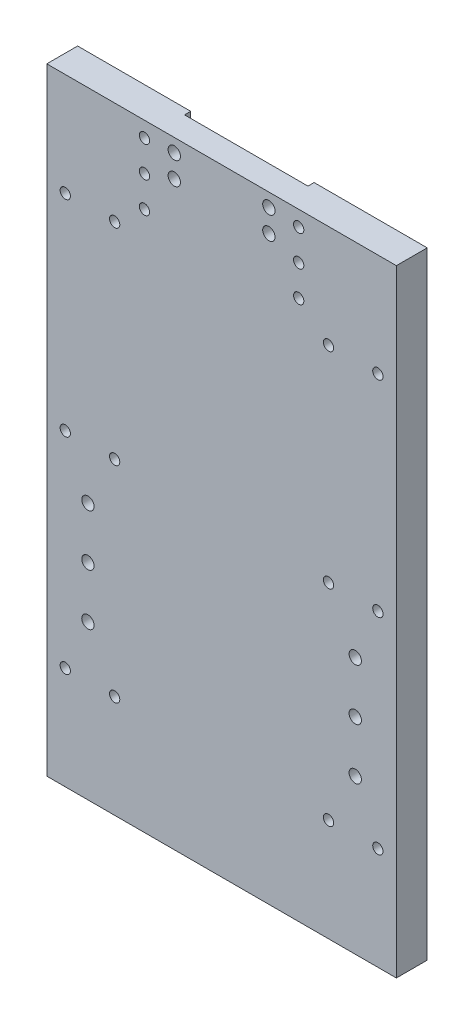
ISO-10303-21;
HEADER;
FILE_DESCRIPTION(('STEP AP214'),'2;1');
FILE_NAME('part.step','',(''),(''),'','','');
FILE_SCHEMA(('AUTOMOTIVE_DESIGN { 1 0 10303 214 1 1 1 1 }'));
ENDSEC;
DATA;
#1=APPLICATION_CONTEXT('core data for automotive mechanical design processes');
#2=APPLICATION_PROTOCOL_DEFINITION('international standard','automotive_design',2000,#1);
#3=PRODUCT_CONTEXT('',#1,'mechanical');
#4=PRODUCT('Part','Part','',(#3));
#5=PRODUCT_RELATED_PRODUCT_CATEGORY('part','',(#4));
#6=PRODUCT_DEFINITION_FORMATION('','',#4);
#7=PRODUCT_DEFINITION_CONTEXT('part definition',#1,'design');
#8=PRODUCT_DEFINITION('design','',#6,#7);
#9=PRODUCT_DEFINITION_SHAPE('','',#8);
#10=(LENGTH_UNIT() NAMED_UNIT(*) SI_UNIT(.MILLI.,.METRE.));
#11=(NAMED_UNIT(*) PLANE_ANGLE_UNIT() SI_UNIT($,.RADIAN.));
#12=(NAMED_UNIT(*) SI_UNIT($,.STERADIAN.) SOLID_ANGLE_UNIT());
#13=UNCERTAINTY_MEASURE_WITH_UNIT(LENGTH_MEASURE(1.E-05),#10,'distance_accuracy_value','');
#14=(GEOMETRIC_REPRESENTATION_CONTEXT(3) GLOBAL_UNCERTAINTY_ASSIGNED_CONTEXT((#13)) GLOBAL_UNIT_ASSIGNED_CONTEXT((#10,
#11,#12)) REPRESENTATION_CONTEXT('',''));
#15=CARTESIAN_POINT('',(0.,0.,0.));
#16=DIRECTION('',(0.,0.,1.));
#17=DIRECTION('',(1.,0.,0.));
#18=AXIS2_PLACEMENT_3D('',#15,#16,#17);
#19=CARTESIAN_POINT('',(0.,0.,15.));
#20=DIRECTION('',(1.,0.,0.));
#21=DIRECTION('',(0.,0.,-1.));
#22=AXIS2_PLACEMENT_3D('',#19,#20,#21);
#23=PLANE('',#22);
#24=DIRECTION('',(0.,-1.,0.));
#25=VECTOR('',#24,1.);
#26=CARTESIAN_POINT('',(0.,0.,0.));
#27=LINE('',#26,#25);
#28=CARTESIAN_POINT('',(0.,300.,0.));
#29=VERTEX_POINT('',#28);
#30=CARTESIAN_POINT('',(0.,0.,0.));
#31=VERTEX_POINT('',#30);
#32=EDGE_CURVE('E213',#29,#31,#27,.T.);
#33=ORIENTED_EDGE('',*,*,#32,.T.);
#34=DIRECTION('',(0.,0.,-1.));
#35=VECTOR('',#34,1.);
#36=CARTESIAN_POINT('',(0.,0.,15.));
#37=LINE('',#36,#35);
#38=CARTESIAN_POINT('',(0.,0.,15.));
#39=VERTEX_POINT('',#38);
#40=EDGE_CURVE('E11',#39,#31,#37,.T.);
#41=ORIENTED_EDGE('',*,*,#40,.F.);
#42=DIRECTION('',(0.,-1.,0.));
#43=VECTOR('',#42,1.);
#44=CARTESIAN_POINT('',(0.,0.,15.));
#45=LINE('',#44,#43);
#46=CARTESIAN_POINT('',(0.,300.,15.));
#47=VERTEX_POINT('',#46);
#48=EDGE_CURVE('E216',#47,#39,#45,.T.);
#49=ORIENTED_EDGE('',*,*,#48,.F.);
#50=DIRECTION('',(0.,0.,-1.));
#51=VECTOR('',#50,1.);
#52=CARTESIAN_POINT('',(0.,300.,15.));
#53=LINE('',#52,#51);
#54=EDGE_CURVE('E223',#47,#29,#53,.T.);
#55=ORIENTED_EDGE('',*,*,#54,.T.);
#56=EDGE_LOOP('',(#33,#41,#49,#55));
#57=FACE_BOUND('',#56,.T.);
#58=ADVANCED_FACE('F32',(#57),#23,.F.);
#59=CARTESIAN_POINT('',(0.,0.,15.));
#60=DIRECTION('',(0.,1.,0.));
#61=DIRECTION('',(0.,0.,1.));
#62=AXIS2_PLACEMENT_3D('',#59,#60,#61);
#63=PLANE('',#62);
#64=DIRECTION('',(1.,0.,0.));
#65=VECTOR('',#64,1.);
#66=CARTESIAN_POINT('',(0.,0.,0.));
#67=LINE('',#66,#65);
#68=CARTESIAN_POINT('',(170.,0.,0.));
#69=VERTEX_POINT('',#68);
#70=EDGE_CURVE('E226',#31,#69,#67,.T.);
#71=ORIENTED_EDGE('',*,*,#70,.T.);
#72=DIRECTION('',(0.,0.,-1.));
#73=VECTOR('',#72,1.);
#74=CARTESIAN_POINT('',(170.,0.,15.));
#75=LINE('',#74,#73);
#76=CARTESIAN_POINT('',(170.,0.,15.));
#77=VERTEX_POINT('',#76);
#78=EDGE_CURVE('E39',#77,#69,#75,.T.);
#79=ORIENTED_EDGE('',*,*,#78,.F.);
#80=DIRECTION('',(1.,0.,0.));
#81=VECTOR('',#80,1.);
#82=CARTESIAN_POINT('',(0.,0.,15.));
#83=LINE('',#82,#81);
#84=EDGE_CURVE('E83',#39,#77,#83,.T.);
#85=ORIENTED_EDGE('',*,*,#84,.F.);
#86=ORIENTED_EDGE('',*,*,#40,.T.);
#87=EDGE_LOOP('',(#71,#79,#85,#86));
#88=FACE_BOUND('',#87,.T.);
#89=ADVANCED_FACE('F267',(#88),#63,.F.);
#90=CARTESIAN_POINT('',(170.,0.,15.));
#91=DIRECTION('',(-1.,0.,0.));
#92=DIRECTION('',(0.,0.,1.));
#93=AXIS2_PLACEMENT_3D('',#90,#91,#92);
#94=PLANE('',#93);
#95=DIRECTION('',(0.,1.,0.));
#96=VECTOR('',#95,1.);
#97=CARTESIAN_POINT('',(170.,0.,0.));
#98=LINE('',#97,#96);
#99=CARTESIAN_POINT('',(170.,300.,0.));
#100=VERTEX_POINT('',#99);
#101=EDGE_CURVE('E228',#69,#100,#98,.T.);
#102=ORIENTED_EDGE('',*,*,#101,.T.);
#103=DIRECTION('',(0.,0.,-1.));
#104=VECTOR('',#103,1.);
#105=CARTESIAN_POINT('',(170.,300.,15.));
#106=LINE('',#105,#104);
#107=CARTESIAN_POINT('',(170.,300.,15.));
#108=VERTEX_POINT('',#107);
#109=EDGE_CURVE('E233',#108,#100,#106,.T.);
#110=ORIENTED_EDGE('',*,*,#109,.F.);
#111=DIRECTION('',(0.,1.,0.));
#112=VECTOR('',#111,1.);
#113=CARTESIAN_POINT('',(170.,0.,15.));
#114=LINE('',#113,#112);
#115=EDGE_CURVE('E220',#77,#108,#114,.T.);
#116=ORIENTED_EDGE('',*,*,#115,.F.);
#117=ORIENTED_EDGE('',*,*,#78,.T.);
#118=EDGE_LOOP('',(#102,#110,#116,#117));
#119=FACE_BOUND('',#118,.T.);
#120=ADVANCED_FACE('F239',(#119),#94,.F.);
#121=CARTESIAN_POINT('',(0.,300.,15.));
#122=DIRECTION('',(0.,-1.,0.));
#123=DIRECTION('',(0.,0.,-1.));
#124=AXIS2_PLACEMENT_3D('',#121,#122,#123);
#125=PLANE('',#124);
#126=DIRECTION('',(-1.,0.,0.));
#127=VECTOR('',#126,1.);
#128=CARTESIAN_POINT('',(0.,300.,0.));
#129=LINE('',#128,#127);
#130=CARTESIAN_POINT('',(115.,300.,0.));
#131=VERTEX_POINT('',#130);
#132=EDGE_CURVE('E218',#100,#131,#129,.T.);
#133=ORIENTED_EDGE('',*,*,#132,.T.);
#134=DIRECTION('',(0.,0.,-1.));
#135=VECTOR('',#134,1.);
#136=CARTESIAN_POINT('',(115.,300.,3.));
#137=LINE('',#136,#135);
#138=CARTESIAN_POINT('',(115.,300.,3.));
#139=VERTEX_POINT('',#138);
#140=EDGE_CURVE('E138',#139,#131,#137,.T.);
#141=ORIENTED_EDGE('',*,*,#140,.F.);
#142=DIRECTION('',(1.,0.,0.));
#143=VECTOR('',#142,1.);
#144=CARTESIAN_POINT('',(115.,300.,3.));
#145=LINE('',#144,#143);
#146=CARTESIAN_POINT('',(55.,300.,3.));
#147=VERTEX_POINT('',#146);
#148=EDGE_CURVE('E112',#147,#139,#145,.T.);
#149=ORIENTED_EDGE('',*,*,#148,.F.);
#150=DIRECTION('',(0.,0.,-1.));
#151=VECTOR('',#150,1.);
#152=CARTESIAN_POINT('',(55.,300.,3.));
#153=LINE('',#152,#151);
#154=CARTESIAN_POINT('',(55.,300.,0.));
#155=VERTEX_POINT('',#154);
#156=EDGE_CURVE('E141',#147,#155,#153,.T.);
#157=ORIENTED_EDGE('',*,*,#156,.T.);
#158=EDGE_CURVE('E76',#155,#29,#129,.T.);
#159=ORIENTED_EDGE('',*,*,#158,.T.);
#160=ORIENTED_EDGE('',*,*,#54,.F.);
#161=DIRECTION('',(-1.,0.,0.));
#162=VECTOR('',#161,1.);
#163=CARTESIAN_POINT('',(0.,300.,15.));
#164=LINE('',#163,#162);
#165=EDGE_CURVE('E55',#108,#47,#164,.T.);
#166=ORIENTED_EDGE('',*,*,#165,.F.);
#167=ORIENTED_EDGE('',*,*,#109,.T.);
#168=EDGE_LOOP('',(#133,#141,#149,#157,#159,#160,#166,#167));
#169=FACE_BOUND('',#168,.T.);
#170=ADVANCED_FACE('F246',(#169),#125,.F.);
#171=CARTESIAN_POINT('',(0.,0.,15.));
#172=DIRECTION('',(0.,0.,-1.));
#173=DIRECTION('',(-1.,0.,0.));
#174=AXIS2_PLACEMENT_3D('',#171,#172,#173);
#175=PLANE('',#174);
#176=CARTESIAN_POINT('',(20.,125.,15.));
#177=DIRECTION('',(0.,0.,1.));
#178=DIRECTION('',(1.,0.,0.));
#179=AXIS2_PLACEMENT_3D('',#176,#177,#178);
#180=CIRCLE('',#179,3.);
#181=CARTESIAN_POINT('',(23.,125.,15.));
#182=VERTEX_POINT('',#181);
#183=EDGE_CURVE('E581',#182,#182,#180,.T.);
#184=ORIENTED_EDGE('',*,*,#183,.F.);
#185=EDGE_LOOP('',(#184));
#186=FACE_BOUND('',#185,.T.);
#187=CARTESIAN_POINT('',(20.,75.,15.));
#188=DIRECTION('',(0.,0.,1.));
#189=DIRECTION('',(-1.,0.,0.));
#190=AXIS2_PLACEMENT_3D('',#187,#188,#189);
#191=CIRCLE('',#190,3.);
#192=CARTESIAN_POINT('',(17.,75.,15.));
#193=VERTEX_POINT('',#192);
#194=EDGE_CURVE('E587',#193,#193,#191,.T.);
#195=ORIENTED_EDGE('',*,*,#194,.F.);
#196=EDGE_LOOP('',(#195));
#197=FACE_BOUND('',#196,.T.);
#198=CARTESIAN_POINT('',(150.,75.,15.));
#199=DIRECTION('',(0.,0.,1.));
#200=DIRECTION('',(1.,0.,0.));
#201=AXIS2_PLACEMENT_3D('',#198,#199,#200);
#202=CIRCLE('',#201,3.00000000000002);
#203=CARTESIAN_POINT('',(153.,75.,15.));
#204=VERTEX_POINT('',#203);
#205=EDGE_CURVE('E595',#204,#204,#202,.T.);
#206=ORIENTED_EDGE('',*,*,#205,.F.);
#207=EDGE_LOOP('',(#206));
#208=FACE_BOUND('',#207,.T.);
#209=CARTESIAN_POINT('',(150.,125.,15.));
#210=DIRECTION('',(0.,0.,1.));
#211=DIRECTION('',(-1.,0.,0.));
#212=AXIS2_PLACEMENT_3D('',#209,#210,#211);
#213=CIRCLE('',#212,3.00000000000002);
#214=CARTESIAN_POINT('',(147.,125.,15.));
#215=VERTEX_POINT('',#214);
#216=EDGE_CURVE('E601',#215,#215,#213,.T.);
#217=ORIENTED_EDGE('',*,*,#216,.F.);
#218=EDGE_LOOP('',(#217));
#219=FACE_BOUND('',#218,.T.);
#220=CARTESIAN_POINT('',(150.,100.,15.));
#221=DIRECTION('',(0.,0.,1.));
#222=DIRECTION('',(-1.,0.,0.));
#223=AXIS2_PLACEMENT_3D('',#220,#221,#222);
#224=CIRCLE('',#223,3.00000000000002);
#225=CARTESIAN_POINT('',(147.,100.,15.));
#226=VERTEX_POINT('',#225);
#227=EDGE_CURVE('E607',#226,#226,#224,.T.);
#228=ORIENTED_EDGE('',*,*,#227,.F.);
#229=EDGE_LOOP('',(#228));
#230=FACE_BOUND('',#229,.T.);
#231=CARTESIAN_POINT('',(20.,100.,15.));
#232=DIRECTION('',(0.,0.,1.));
#233=DIRECTION('',(1.,0.,0.));
#234=AXIS2_PLACEMENT_3D('',#231,#232,#233);
#235=CIRCLE('',#234,3.);
#236=CARTESIAN_POINT('',(23.,100.,15.));
#237=VERTEX_POINT('',#236);
#238=EDGE_CURVE('E584',#237,#237,#235,.T.);
#239=ORIENTED_EDGE('',*,*,#238,.F.);
#240=EDGE_LOOP('',(#239));
#241=FACE_BOUND('',#240,.T.);
#242=CARTESIAN_POINT('',(47.5,277.5,15.));
#243=DIRECTION('',(0.,0.,1.));
#244=DIRECTION('',(1.,0.,0.));
#245=AXIS2_PLACEMENT_3D('',#242,#243,#244);
#246=CIRCLE('',#245,2.5);
#247=CARTESIAN_POINT('',(50.,277.5,15.));
#248=VERTEX_POINT('',#247);
#249=EDGE_CURVE('E620',#248,#248,#246,.T.);
#250=ORIENTED_EDGE('',*,*,#249,.F.);
#251=EDGE_LOOP('',(#250));
#252=FACE_BOUND('',#251,.T.);
#253=CARTESIAN_POINT('',(47.5,262.5,15.));
#254=DIRECTION('',(0.,0.,1.));
#255=DIRECTION('',(-1.,0.,0.));
#256=AXIS2_PLACEMENT_3D('',#253,#254,#255);
#257=CIRCLE('',#256,2.5);
#258=CARTESIAN_POINT('',(45.,262.5,15.));
#259=VERTEX_POINT('',#258);
#260=EDGE_CURVE('E626',#259,#259,#257,.T.);
#261=ORIENTED_EDGE('',*,*,#260,.F.);
#262=EDGE_LOOP('',(#261));
#263=FACE_BOUND('',#262,.T.);
#264=CARTESIAN_POINT('',(122.5,262.5,15.));
#265=DIRECTION('',(0.,0.,1.));
#266=DIRECTION('',(1.,0.,0.));
#267=AXIS2_PLACEMENT_3D('',#264,#265,#266);
#268=CIRCLE('',#267,2.5);
#269=CARTESIAN_POINT('',(125.,262.5,15.));
#270=VERTEX_POINT('',#269);
#271=EDGE_CURVE('E632',#270,#270,#268,.T.);
#272=ORIENTED_EDGE('',*,*,#271,.F.);
#273=EDGE_LOOP('',(#272));
#274=FACE_BOUND('',#273,.T.);
#275=CARTESIAN_POINT('',(122.5,277.5,15.));
#276=DIRECTION('',(0.,0.,1.));
#277=DIRECTION('',(-1.,0.,0.));
#278=AXIS2_PLACEMENT_3D('',#275,#276,#277);
#279=CIRCLE('',#278,2.5);
#280=CARTESIAN_POINT('',(120.,277.5,15.));
#281=VERTEX_POINT('',#280);
#282=EDGE_CURVE('E638',#281,#281,#279,.T.);
#283=ORIENTED_EDGE('',*,*,#282,.F.);
#284=EDGE_LOOP('',(#283));
#285=FACE_BOUND('',#284,.T.);
#286=CARTESIAN_POINT('',(122.5,292.5,15.));
#287=DIRECTION('',(0.,0.,1.));
#288=DIRECTION('',(-1.,0.,0.));
#289=AXIS2_PLACEMENT_3D('',#286,#287,#288);
#290=CIRCLE('',#289,2.5);
#291=CARTESIAN_POINT('',(120.,292.5,15.));
#292=VERTEX_POINT('',#291);
#293=EDGE_CURVE('E613',#292,#292,#290,.T.);
#294=ORIENTED_EDGE('',*,*,#293,.F.);
#295=EDGE_LOOP('',(#294));
#296=FACE_BOUND('',#295,.T.);
#297=CARTESIAN_POINT('',(47.5,292.5,15.));
#298=DIRECTION('',(0.,0.,1.));
#299=DIRECTION('',(1.,0.,0.));
#300=AXIS2_PLACEMENT_3D('',#297,#298,#299);
#301=CIRCLE('',#300,2.5);
#302=CARTESIAN_POINT('',(50.,292.5,15.));
#303=VERTEX_POINT('',#302);
#304=EDGE_CURVE('E619',#303,#303,#301,.T.);
#305=ORIENTED_EDGE('',*,*,#304,.F.);
#306=EDGE_LOOP('',(#305));
#307=FACE_BOUND('',#306,.T.);
#308=CARTESIAN_POINT('',(62.,282.5,15.));
#309=DIRECTION('',(0.,0.,-1.));
#310=DIRECTION('',(-1.,0.,0.));
#311=AXIS2_PLACEMENT_3D('',#308,#309,#310);
#312=CIRCLE('',#311,3.);
#313=CARTESIAN_POINT('',(59.,282.5,15.));
#314=VERTEX_POINT('',#313);
#315=EDGE_CURVE('E652',#314,#314,#312,.T.);
#316=ORIENTED_EDGE('',*,*,#315,.T.);
#317=EDGE_LOOP('',(#316));
#318=FACE_BOUND('',#317,.T.);
#319=CARTESIAN_POINT('',(108.,282.5,15.));
#320=DIRECTION('',(0.,0.,-1.));
#321=DIRECTION('',(-1.,0.,0.));
#322=AXIS2_PLACEMENT_3D('',#319,#320,#321);
#323=CIRCLE('',#322,3.00000000000001);
#324=CARTESIAN_POINT('',(105.,282.5,15.));
#325=VERTEX_POINT('',#324);
#326=EDGE_CURVE('E658',#325,#325,#323,.T.);
#327=ORIENTED_EDGE('',*,*,#326,.T.);
#328=EDGE_LOOP('',(#327));
#329=FACE_BOUND('',#328,.T.);
#330=CARTESIAN_POINT('',(62.,293.5,15.));
#331=DIRECTION('',(0.,0.,-1.));
#332=DIRECTION('',(-1.,0.,0.));
#333=AXIS2_PLACEMENT_3D('',#330,#331,#332);
#334=CIRCLE('',#333,3.);
#335=CARTESIAN_POINT('',(59.,293.5,15.));
#336=VERTEX_POINT('',#335);
#337=EDGE_CURVE('E664',#336,#336,#334,.T.);
#338=ORIENTED_EDGE('',*,*,#337,.T.);
#339=EDGE_LOOP('',(#338));
#340=FACE_BOUND('',#339,.T.);
#341=CARTESIAN_POINT('',(108.,293.5,15.));
#342=DIRECTION('',(0.,0.,-1.));
#343=DIRECTION('',(-1.,0.,0.));
#344=AXIS2_PLACEMENT_3D('',#341,#342,#343);
#345=CIRCLE('',#344,3.00000000000001);
#346=CARTESIAN_POINT('',(105.,293.5,15.));
#347=VERTEX_POINT('',#346);
#348=EDGE_CURVE('E136',#347,#347,#345,.T.);
#349=ORIENTED_EDGE('',*,*,#348,.T.);
#350=EDGE_LOOP('',(#349));
#351=FACE_BOUND('',#350,.T.);
#352=CARTESIAN_POINT('',(161.,250.,15.));
#353=DIRECTION('',(0.,0.,1.));
#354=DIRECTION('',(-1.,0.,0.));
#355=AXIS2_PLACEMENT_3D('',#352,#353,#354);
#356=CIRCLE('',#355,2.50000000000002);
#357=CARTESIAN_POINT('',(158.5,250.,15.));
#358=VERTEX_POINT('',#357);
#359=EDGE_CURVE('E140',#358,#358,#356,.T.);
#360=ORIENTED_EDGE('',*,*,#359,.F.);
#361=EDGE_LOOP('',(#360));
#362=FACE_BOUND('',#361,.T.);
#363=CARTESIAN_POINT('',(137.,250.,15.));
#364=DIRECTION('',(0.,0.,1.));
#365=DIRECTION('',(1.,0.,0.));
#366=AXIS2_PLACEMENT_3D('',#363,#364,#365);
#367=CIRCLE('',#366,2.5);
#368=CARTESIAN_POINT('',(139.5,250.,15.));
#369=VERTEX_POINT('',#368);
#370=EDGE_CURVE('E147',#369,#369,#367,.T.);
#371=ORIENTED_EDGE('',*,*,#370,.F.);
#372=EDGE_LOOP('',(#371));
#373=FACE_BOUND('',#372,.T.);
#374=CARTESIAN_POINT('',(161.,150.,15.));
#375=DIRECTION('',(0.,0.,1.));
#376=DIRECTION('',(-1.,0.,0.));
#377=AXIS2_PLACEMENT_3D('',#374,#375,#376);
#378=CIRCLE('',#377,2.50000000000002);
#379=CARTESIAN_POINT('',(158.5,150.,15.));
#380=VERTEX_POINT('',#379);
#381=EDGE_CURVE('E153',#380,#380,#378,.T.);
#382=ORIENTED_EDGE('',*,*,#381,.F.);
#383=EDGE_LOOP('',(#382));
#384=FACE_BOUND('',#383,.T.);
#385=CARTESIAN_POINT('',(137.,150.,15.));
#386=DIRECTION('',(0.,0.,1.));
#387=DIRECTION('',(1.,0.,0.));
#388=AXIS2_PLACEMENT_3D('',#385,#386,#387);
#389=CIRCLE('',#388,2.50000000000002);
#390=CARTESIAN_POINT('',(139.5,150.,15.));
#391=VERTEX_POINT('',#390);
#392=EDGE_CURVE('E159',#391,#391,#389,.T.);
#393=ORIENTED_EDGE('',*,*,#392,.F.);
#394=EDGE_LOOP('',(#393));
#395=FACE_BOUND('',#394,.T.);
#396=CARTESIAN_POINT('',(137.,50.,15.));
#397=DIRECTION('',(0.,0.,1.));
#398=DIRECTION('',(-1.,0.,0.));
#399=AXIS2_PLACEMENT_3D('',#396,#397,#398);
#400=CIRCLE('',#399,2.5);
#401=CARTESIAN_POINT('',(134.5,50.,15.));
#402=VERTEX_POINT('',#401);
#403=EDGE_CURVE('E165',#402,#402,#400,.T.);
#404=ORIENTED_EDGE('',*,*,#403,.F.);
#405=EDGE_LOOP('',(#404));
#406=FACE_BOUND('',#405,.T.);
#407=CARTESIAN_POINT('',(161.,50.,15.));
#408=DIRECTION('',(0.,0.,1.));
#409=DIRECTION('',(1.,0.,0.));
#410=AXIS2_PLACEMENT_3D('',#407,#408,#409);
#411=CIRCLE('',#410,2.50000000000002);
#412=CARTESIAN_POINT('',(163.5,50.,15.));
#413=VERTEX_POINT('',#412);
#414=EDGE_CURVE('E171',#413,#413,#411,.T.);
#415=ORIENTED_EDGE('',*,*,#414,.F.);
#416=EDGE_LOOP('',(#415));
#417=FACE_BOUND('',#416,.T.);
#418=CARTESIAN_POINT('',(9.00000000000004,50.,15.));
#419=DIRECTION('',(0.,0.,1.));
#420=DIRECTION('',(-1.,0.,0.));
#421=AXIS2_PLACEMENT_3D('',#418,#419,#420);
#422=CIRCLE('',#421,2.5);
#423=CARTESIAN_POINT('',(6.50000000000003,50.,15.));
#424=VERTEX_POINT('',#423);
#425=EDGE_CURVE('E177',#424,#424,#422,.T.);
#426=ORIENTED_EDGE('',*,*,#425,.F.);
#427=EDGE_LOOP('',(#426));
#428=FACE_BOUND('',#427,.T.);
#429=CARTESIAN_POINT('',(33.,50.,15.));
#430=DIRECTION('',(0.,0.,1.));
#431=DIRECTION('',(1.,0.,0.));
#432=AXIS2_PLACEMENT_3D('',#429,#430,#431);
#433=CIRCLE('',#432,2.50000000000001);
#434=CARTESIAN_POINT('',(35.5,50.,15.));
#435=VERTEX_POINT('',#434);
#436=EDGE_CURVE('E183',#435,#435,#433,.T.);
#437=ORIENTED_EDGE('',*,*,#436,.F.);
#438=EDGE_LOOP('',(#437));
#439=FACE_BOUND('',#438,.T.);
#440=CARTESIAN_POINT('',(33.,150.,15.));
#441=DIRECTION('',(0.,0.,1.));
#442=DIRECTION('',(-1.,0.,0.));
#443=AXIS2_PLACEMENT_3D('',#440,#441,#442);
#444=CIRCLE('',#443,2.5);
#445=CARTESIAN_POINT('',(30.5,150.,15.));
#446=VERTEX_POINT('',#445);
#447=EDGE_CURVE('E189',#446,#446,#444,.T.);
#448=ORIENTED_EDGE('',*,*,#447,.F.);
#449=EDGE_LOOP('',(#448));
#450=FACE_BOUND('',#449,.T.);
#451=CARTESIAN_POINT('',(9.00000000000001,150.,15.));
#452=DIRECTION('',(0.,0.,1.));
#453=DIRECTION('',(1.,0.,0.));
#454=AXIS2_PLACEMENT_3D('',#451,#452,#453);
#455=CIRCLE('',#454,2.5);
#456=CARTESIAN_POINT('',(11.5,150.,15.));
#457=VERTEX_POINT('',#456);
#458=EDGE_CURVE('E195',#457,#457,#455,.T.);
#459=ORIENTED_EDGE('',*,*,#458,.F.);
#460=EDGE_LOOP('',(#459));
#461=FACE_BOUND('',#460,.T.);
#462=CARTESIAN_POINT('',(33.,250.,15.));
#463=DIRECTION('',(0.,0.,1.));
#464=DIRECTION('',(-1.,0.,0.));
#465=AXIS2_PLACEMENT_3D('',#462,#463,#464);
#466=CIRCLE('',#465,2.5);
#467=CARTESIAN_POINT('',(30.5,250.,15.));
#468=VERTEX_POINT('',#467);
#469=EDGE_CURVE('E201',#468,#468,#466,.T.);
#470=ORIENTED_EDGE('',*,*,#469,.F.);
#471=EDGE_LOOP('',(#470));
#472=FACE_BOUND('',#471,.T.);
#473=CARTESIAN_POINT('',(9.00000000000001,250.,15.));
#474=DIRECTION('',(0.,0.,1.));
#475=DIRECTION('',(1.,0.,0.));
#476=AXIS2_PLACEMENT_3D('',#473,#474,#475);
#477=CIRCLE('',#476,2.5);
#478=CARTESIAN_POINT('',(11.5,250.,15.));
#479=VERTEX_POINT('',#478);
#480=EDGE_CURVE('E207',#479,#479,#477,.T.);
#481=ORIENTED_EDGE('',*,*,#480,.F.);
#482=EDGE_LOOP('',(#481));
#483=FACE_BOUND('',#482,.T.);
#484=ORIENTED_EDGE('',*,*,#48,.T.);
#485=ORIENTED_EDGE('',*,*,#84,.T.);
#486=ORIENTED_EDGE('',*,*,#115,.T.);
#487=ORIENTED_EDGE('',*,*,#165,.T.);
#488=EDGE_LOOP('',(#484,#485,#486,#487));
#489=FACE_BOUND('',#488,.T.);
#490=ADVANCED_FACE('F250',(#186,#197,#208,#219,#230,#241,#252,#263,#274,#285,#296,#307,#318,
#329,#340,#351,#362,#373,#384,#395,#406,#417,#428,#439,#450,#461,#472,#483,#489),#175,.F.);
#491=CARTESIAN_POINT('',(0.,0.,0.));
#492=DIRECTION('',(0.,0.,-1.));
#493=DIRECTION('',(-1.,0.,0.));
#494=AXIS2_PLACEMENT_3D('',#491,#492,#493);
#495=PLANE('',#494);
#496=CARTESIAN_POINT('',(20.,125.,0.));
#497=DIRECTION('',(0.,0.,1.));
#498=DIRECTION('',(1.,0.,0.));
#499=AXIS2_PLACEMENT_3D('',#496,#497,#498);
#500=CIRCLE('',#499,3.);
#501=CARTESIAN_POINT('',(23.,125.,0.));
#502=VERTEX_POINT('',#501);
#503=EDGE_CURVE('E579',#502,#502,#500,.T.);
#504=ORIENTED_EDGE('',*,*,#503,.T.);
#505=EDGE_LOOP('',(#504));
#506=FACE_BOUND('',#505,.T.);
#507=CARTESIAN_POINT('',(20.,75.,0.));
#508=DIRECTION('',(0.,0.,1.));
#509=DIRECTION('',(-1.,0.,0.));
#510=AXIS2_PLACEMENT_3D('',#507,#508,#509);
#511=CIRCLE('',#510,3.);
#512=CARTESIAN_POINT('',(17.,75.,0.));
#513=VERTEX_POINT('',#512);
#514=EDGE_CURVE('E582',#513,#513,#511,.T.);
#515=ORIENTED_EDGE('',*,*,#514,.T.);
#516=EDGE_LOOP('',(#515));
#517=FACE_BOUND('',#516,.T.);
#518=CARTESIAN_POINT('',(150.,75.,0.));
#519=DIRECTION('',(0.,0.,1.));
#520=DIRECTION('',(1.,0.,0.));
#521=AXIS2_PLACEMENT_3D('',#518,#519,#520);
#522=CIRCLE('',#521,3.00000000000002);
#523=CARTESIAN_POINT('',(153.,75.,0.));
#524=VERTEX_POINT('',#523);
#525=EDGE_CURVE('E592',#524,#524,#522,.T.);
#526=ORIENTED_EDGE('',*,*,#525,.T.);
#527=EDGE_LOOP('',(#526));
#528=FACE_BOUND('',#527,.T.);
#529=CARTESIAN_POINT('',(150.,125.,0.));
#530=DIRECTION('',(0.,0.,1.));
#531=DIRECTION('',(-1.,0.,0.));
#532=AXIS2_PLACEMENT_3D('',#529,#530,#531);
#533=CIRCLE('',#532,3.00000000000002);
#534=CARTESIAN_POINT('',(147.,125.,0.));
#535=VERTEX_POINT('',#534);
#536=EDGE_CURVE('E598',#535,#535,#533,.T.);
#537=ORIENTED_EDGE('',*,*,#536,.T.);
#538=EDGE_LOOP('',(#537));
#539=FACE_BOUND('',#538,.T.);
#540=CARTESIAN_POINT('',(150.,100.,0.));
#541=DIRECTION('',(0.,0.,1.));
#542=DIRECTION('',(-1.,0.,0.));
#543=AXIS2_PLACEMENT_3D('',#540,#541,#542);
#544=CIRCLE('',#543,3.00000000000002);
#545=CARTESIAN_POINT('',(147.,100.,0.));
#546=VERTEX_POINT('',#545);
#547=EDGE_CURVE('E604',#546,#546,#544,.T.);
#548=ORIENTED_EDGE('',*,*,#547,.T.);
#549=EDGE_LOOP('',(#548));
#550=FACE_BOUND('',#549,.T.);
#551=CARTESIAN_POINT('',(20.,100.,0.));
#552=DIRECTION('',(0.,0.,1.));
#553=DIRECTION('',(1.,0.,0.));
#554=AXIS2_PLACEMENT_3D('',#551,#552,#553);
#555=CIRCLE('',#554,3.);
#556=CARTESIAN_POINT('',(23.,100.,0.));
#557=VERTEX_POINT('',#556);
#558=EDGE_CURVE('E610',#557,#557,#555,.T.);
#559=ORIENTED_EDGE('',*,*,#558,.T.);
#560=EDGE_LOOP('',(#559));
#561=FACE_BOUND('',#560,.T.);
#562=CARTESIAN_POINT('',(47.5,277.5,0.));
#563=DIRECTION('',(0.,0.,1.));
#564=DIRECTION('',(1.,0.,0.));
#565=AXIS2_PLACEMENT_3D('',#562,#563,#564);
#566=CIRCLE('',#565,2.5);
#567=CARTESIAN_POINT('',(50.,277.5,0.));
#568=VERTEX_POINT('',#567);
#569=EDGE_CURVE('E616',#568,#568,#566,.T.);
#570=ORIENTED_EDGE('',*,*,#569,.T.);
#571=EDGE_LOOP('',(#570));
#572=FACE_BOUND('',#571,.T.);
#573=CARTESIAN_POINT('',(47.5,262.5,0.));
#574=DIRECTION('',(0.,0.,1.));
#575=DIRECTION('',(-1.,0.,0.));
#576=AXIS2_PLACEMENT_3D('',#573,#574,#575);
#577=CIRCLE('',#576,2.5);
#578=CARTESIAN_POINT('',(45.,262.5,0.));
#579=VERTEX_POINT('',#578);
#580=EDGE_CURVE('E623',#579,#579,#577,.T.);
#581=ORIENTED_EDGE('',*,*,#580,.T.);
#582=EDGE_LOOP('',(#581));
#583=FACE_BOUND('',#582,.T.);
#584=CARTESIAN_POINT('',(122.5,262.5,0.));
#585=DIRECTION('',(0.,0.,1.));
#586=DIRECTION('',(1.,0.,0.));
#587=AXIS2_PLACEMENT_3D('',#584,#585,#586);
#588=CIRCLE('',#587,2.5);
#589=CARTESIAN_POINT('',(125.,262.5,0.));
#590=VERTEX_POINT('',#589);
#591=EDGE_CURVE('E629',#590,#590,#588,.T.);
#592=ORIENTED_EDGE('',*,*,#591,.T.);
#593=EDGE_LOOP('',(#592));
#594=FACE_BOUND('',#593,.T.);
#595=CARTESIAN_POINT('',(122.5,277.5,0.));
#596=DIRECTION('',(0.,0.,1.));
#597=DIRECTION('',(-1.,0.,0.));
#598=AXIS2_PLACEMENT_3D('',#595,#596,#597);
#599=CIRCLE('',#598,2.5);
#600=CARTESIAN_POINT('',(120.,277.5,0.));
#601=VERTEX_POINT('',#600);
#602=EDGE_CURVE('E635',#601,#601,#599,.T.);
#603=ORIENTED_EDGE('',*,*,#602,.T.);
#604=EDGE_LOOP('',(#603));
#605=FACE_BOUND('',#604,.T.);
#606=CARTESIAN_POINT('',(122.5,292.5,0.));
#607=DIRECTION('',(0.,0.,1.));
#608=DIRECTION('',(-1.,0.,0.));
#609=AXIS2_PLACEMENT_3D('',#606,#607,#608);
#610=CIRCLE('',#609,2.5);
#611=CARTESIAN_POINT('',(120.,292.5,0.));
#612=VERTEX_POINT('',#611);
#613=EDGE_CURVE('E641',#612,#612,#610,.T.);
#614=ORIENTED_EDGE('',*,*,#613,.T.);
#615=EDGE_LOOP('',(#614));
#616=FACE_BOUND('',#615,.T.);
#617=CARTESIAN_POINT('',(47.5,292.5,0.));
#618=DIRECTION('',(0.,0.,1.));
#619=DIRECTION('',(1.,0.,0.));
#620=AXIS2_PLACEMENT_3D('',#617,#618,#619);
#621=CIRCLE('',#620,2.5);
#622=CARTESIAN_POINT('',(50.,292.5,0.));
#623=VERTEX_POINT('',#622);
#624=EDGE_CURVE('E646',#623,#623,#621,.T.);
#625=ORIENTED_EDGE('',*,*,#624,.T.);
#626=EDGE_LOOP('',(#625));
#627=FACE_BOUND('',#626,.T.);
#628=DIRECTION('',(0.,-1.,0.));
#629=VECTOR('',#628,1.);
#630=CARTESIAN_POINT('',(115.,300.,0.));
#631=LINE('',#630,#629);
#632=CARTESIAN_POINT('',(115.,275.,0.));
#633=VERTEX_POINT('',#632);
#634=EDGE_CURVE('E46',#131,#633,#631,.T.);
#635=ORIENTED_EDGE('',*,*,#634,.F.);
#636=ORIENTED_EDGE('',*,*,#132,.F.);
#637=ORIENTED_EDGE('',*,*,#101,.F.);
#638=ORIENTED_EDGE('',*,*,#70,.F.);
#639=ORIENTED_EDGE('',*,*,#32,.F.);
#640=ORIENTED_EDGE('',*,*,#158,.F.);
#641=DIRECTION('',(0.,1.,0.));
#642=VECTOR('',#641,1.);
#643=CARTESIAN_POINT('',(55.,300.,0.));
#644=LINE('',#643,#642);
#645=CARTESIAN_POINT('',(55.,275.,0.));
#646=VERTEX_POINT('',#645);
#647=EDGE_CURVE('E125',#646,#155,#644,.T.);
#648=ORIENTED_EDGE('',*,*,#647,.F.);
#649=DIRECTION('',(-1.,0.,0.));
#650=VECTOR('',#649,1.);
#651=CARTESIAN_POINT('',(115.,275.,0.));
#652=LINE('',#651,#650);
#653=EDGE_CURVE('E127',#633,#646,#652,.T.);
#654=ORIENTED_EDGE('',*,*,#653,.F.);
#655=EDGE_LOOP('',(#635,#636,#637,#638,#639,#640,#648,#654));
#656=FACE_BOUND('',#655,.T.);
#657=CARTESIAN_POINT('',(161.,250.,0.));
#658=DIRECTION('',(0.,0.,1.));
#659=DIRECTION('',(-1.,0.,0.));
#660=AXIS2_PLACEMENT_3D('',#657,#658,#659);
#661=CIRCLE('',#660,2.50000000000002);
#662=CARTESIAN_POINT('',(158.5,250.,0.));
#663=VERTEX_POINT('',#662);
#664=EDGE_CURVE('E144',#663,#663,#661,.T.);
#665=ORIENTED_EDGE('',*,*,#664,.T.);
#666=EDGE_LOOP('',(#665));
#667=FACE_BOUND('',#666,.T.);
#668=CARTESIAN_POINT('',(137.,250.,0.));
#669=DIRECTION('',(0.,0.,1.));
#670=DIRECTION('',(1.,0.,0.));
#671=AXIS2_PLACEMENT_3D('',#668,#669,#670);
#672=CIRCLE('',#671,2.5);
#673=CARTESIAN_POINT('',(139.5,250.,0.));
#674=VERTEX_POINT('',#673);
#675=EDGE_CURVE('E150',#674,#674,#672,.T.);
#676=ORIENTED_EDGE('',*,*,#675,.T.);
#677=EDGE_LOOP('',(#676));
#678=FACE_BOUND('',#677,.T.);
#679=CARTESIAN_POINT('',(161.,150.,0.));
#680=DIRECTION('',(0.,0.,1.));
#681=DIRECTION('',(-1.,0.,0.));
#682=AXIS2_PLACEMENT_3D('',#679,#680,#681);
#683=CIRCLE('',#682,2.50000000000002);
#684=CARTESIAN_POINT('',(158.5,150.,0.));
#685=VERTEX_POINT('',#684);
#686=EDGE_CURVE('E156',#685,#685,#683,.T.);
#687=ORIENTED_EDGE('',*,*,#686,.T.);
#688=EDGE_LOOP('',(#687));
#689=FACE_BOUND('',#688,.T.);
#690=CARTESIAN_POINT('',(137.,150.,0.));
#691=DIRECTION('',(0.,0.,1.));
#692=DIRECTION('',(1.,0.,0.));
#693=AXIS2_PLACEMENT_3D('',#690,#691,#692);
#694=CIRCLE('',#693,2.50000000000002);
#695=CARTESIAN_POINT('',(139.5,150.,0.));
#696=VERTEX_POINT('',#695);
#697=EDGE_CURVE('E162',#696,#696,#694,.T.);
#698=ORIENTED_EDGE('',*,*,#697,.T.);
#699=EDGE_LOOP('',(#698));
#700=FACE_BOUND('',#699,.T.);
#701=CARTESIAN_POINT('',(137.,50.,0.));
#702=DIRECTION('',(0.,0.,1.));
#703=DIRECTION('',(-1.,0.,0.));
#704=AXIS2_PLACEMENT_3D('',#701,#702,#703);
#705=CIRCLE('',#704,2.5);
#706=CARTESIAN_POINT('',(134.5,50.,0.));
#707=VERTEX_POINT('',#706);
#708=EDGE_CURVE('E168',#707,#707,#705,.T.);
#709=ORIENTED_EDGE('',*,*,#708,.T.);
#710=EDGE_LOOP('',(#709));
#711=FACE_BOUND('',#710,.T.);
#712=CARTESIAN_POINT('',(161.,50.,0.));
#713=DIRECTION('',(0.,0.,1.));
#714=DIRECTION('',(1.,0.,0.));
#715=AXIS2_PLACEMENT_3D('',#712,#713,#714);
#716=CIRCLE('',#715,2.50000000000002);
#717=CARTESIAN_POINT('',(163.5,50.,0.));
#718=VERTEX_POINT('',#717);
#719=EDGE_CURVE('E174',#718,#718,#716,.T.);
#720=ORIENTED_EDGE('',*,*,#719,.T.);
#721=EDGE_LOOP('',(#720));
#722=FACE_BOUND('',#721,.T.);
#723=CARTESIAN_POINT('',(9.00000000000004,50.,0.));
#724=DIRECTION('',(0.,0.,1.));
#725=DIRECTION('',(-1.,0.,0.));
#726=AXIS2_PLACEMENT_3D('',#723,#724,#725);
#727=CIRCLE('',#726,2.5);
#728=CARTESIAN_POINT('',(6.50000000000003,50.,0.));
#729=VERTEX_POINT('',#728);
#730=EDGE_CURVE('E180',#729,#729,#727,.T.);
#731=ORIENTED_EDGE('',*,*,#730,.T.);
#732=EDGE_LOOP('',(#731));
#733=FACE_BOUND('',#732,.T.);
#734=CARTESIAN_POINT('',(33.,50.,0.));
#735=DIRECTION('',(0.,0.,1.));
#736=DIRECTION('',(1.,0.,0.));
#737=AXIS2_PLACEMENT_3D('',#734,#735,#736);
#738=CIRCLE('',#737,2.50000000000001);
#739=CARTESIAN_POINT('',(35.5,50.,0.));
#740=VERTEX_POINT('',#739);
#741=EDGE_CURVE('E186',#740,#740,#738,.T.);
#742=ORIENTED_EDGE('',*,*,#741,.T.);
#743=EDGE_LOOP('',(#742));
#744=FACE_BOUND('',#743,.T.);
#745=CARTESIAN_POINT('',(33.,150.,0.));
#746=DIRECTION('',(0.,0.,1.));
#747=DIRECTION('',(-1.,0.,0.));
#748=AXIS2_PLACEMENT_3D('',#745,#746,#747);
#749=CIRCLE('',#748,2.5);
#750=CARTESIAN_POINT('',(30.5,150.,0.));
#751=VERTEX_POINT('',#750);
#752=EDGE_CURVE('E192',#751,#751,#749,.T.);
#753=ORIENTED_EDGE('',*,*,#752,.T.);
#754=EDGE_LOOP('',(#753));
#755=FACE_BOUND('',#754,.T.);
#756=CARTESIAN_POINT('',(9.00000000000001,150.,0.));
#757=DIRECTION('',(0.,0.,1.));
#758=DIRECTION('',(1.,0.,0.));
#759=AXIS2_PLACEMENT_3D('',#756,#757,#758);
#760=CIRCLE('',#759,2.5);
#761=CARTESIAN_POINT('',(11.5,150.,0.));
#762=VERTEX_POINT('',#761);
#763=EDGE_CURVE('E198',#762,#762,#760,.T.);
#764=ORIENTED_EDGE('',*,*,#763,.T.);
#765=EDGE_LOOP('',(#764));
#766=FACE_BOUND('',#765,.T.);
#767=CARTESIAN_POINT('',(33.,250.,0.));
#768=DIRECTION('',(0.,0.,1.));
#769=DIRECTION('',(-1.,0.,0.));
#770=AXIS2_PLACEMENT_3D('',#767,#768,#769);
#771=CIRCLE('',#770,2.5);
#772=CARTESIAN_POINT('',(30.5,250.,0.));
#773=VERTEX_POINT('',#772);
#774=EDGE_CURVE('E204',#773,#773,#771,.T.);
#775=ORIENTED_EDGE('',*,*,#774,.T.);
#776=EDGE_LOOP('',(#775));
#777=FACE_BOUND('',#776,.T.);
#778=CARTESIAN_POINT('',(9.00000000000001,250.,0.));
#779=DIRECTION('',(0.,0.,1.));
#780=DIRECTION('',(1.,0.,0.));
#781=AXIS2_PLACEMENT_3D('',#778,#779,#780);
#782=CIRCLE('',#781,2.5);
#783=CARTESIAN_POINT('',(11.5,250.,0.));
#784=VERTEX_POINT('',#783);
#785=EDGE_CURVE('E210',#784,#784,#782,.T.);
#786=ORIENTED_EDGE('',*,*,#785,.T.);
#787=EDGE_LOOP('',(#786));
#788=FACE_BOUND('',#787,.T.);
#789=ADVANCED_FACE('F243',(#506,#517,#528,#539,#550,#561,#572,#583,#594,#605,#616,#627,#656,
#667,#678,#689,#700,#711,#722,#733,#744,#755,#766,#777,#788),#495,.T.);
#790=CARTESIAN_POINT('',(9.00000000000001,250.,0.));
#791=DIRECTION('',(0.,0.,1.));
#792=DIRECTION('',(1.,0.,0.));
#793=AXIS2_PLACEMENT_3D('',#790,#791,#792);
#794=CYLINDRICAL_SURFACE('',#793,2.5);
#795=ORIENTED_EDGE('',*,*,#785,.F.);
#796=EDGE_LOOP('',(#795));
#797=FACE_BOUND('',#796,.T.);
#798=ORIENTED_EDGE('',*,*,#480,.T.);
#799=EDGE_LOOP('',(#798));
#800=FACE_BOUND('',#799,.T.);
#801=ADVANCED_FACE('F258',(#797,#800),#794,.F.);
#802=CARTESIAN_POINT('',(33.,250.,0.));
#803=DIRECTION('',(0.,0.,1.));
#804=DIRECTION('',(1.,0.,0.));
#805=AXIS2_PLACEMENT_3D('',#802,#803,#804);
#806=CYLINDRICAL_SURFACE('',#805,2.5);
#807=ORIENTED_EDGE('',*,*,#774,.F.);
#808=EDGE_LOOP('',(#807));
#809=FACE_BOUND('',#808,.T.);
#810=ORIENTED_EDGE('',*,*,#469,.T.);
#811=EDGE_LOOP('',(#810));
#812=FACE_BOUND('',#811,.T.);
#813=ADVANCED_FACE('F328',(#809,#812),#806,.F.);
#814=CARTESIAN_POINT('',(9.00000000000001,150.,0.));
#815=DIRECTION('',(0.,0.,1.));
#816=DIRECTION('',(1.,0.,0.));
#817=AXIS2_PLACEMENT_3D('',#814,#815,#816);
#818=CYLINDRICAL_SURFACE('',#817,2.5);
#819=ORIENTED_EDGE('',*,*,#763,.F.);
#820=EDGE_LOOP('',(#819));
#821=FACE_BOUND('',#820,.T.);
#822=ORIENTED_EDGE('',*,*,#458,.T.);
#823=EDGE_LOOP('',(#822));
#824=FACE_BOUND('',#823,.T.);
#825=ADVANCED_FACE('F324',(#821,#824),#818,.F.);
#826=CARTESIAN_POINT('',(33.,150.,0.));
#827=DIRECTION('',(0.,0.,1.));
#828=DIRECTION('',(1.,0.,0.));
#829=AXIS2_PLACEMENT_3D('',#826,#827,#828);
#830=CYLINDRICAL_SURFACE('',#829,2.5);
#831=ORIENTED_EDGE('',*,*,#752,.F.);
#832=EDGE_LOOP('',(#831));
#833=FACE_BOUND('',#832,.T.);
#834=ORIENTED_EDGE('',*,*,#447,.T.);
#835=EDGE_LOOP('',(#834));
#836=FACE_BOUND('',#835,.T.);
#837=ADVANCED_FACE('F320',(#833,#836),#830,.F.);
#838=CARTESIAN_POINT('',(33.,50.,0.));
#839=DIRECTION('',(0.,0.,1.));
#840=DIRECTION('',(1.,0.,0.));
#841=AXIS2_PLACEMENT_3D('',#838,#839,#840);
#842=CYLINDRICAL_SURFACE('',#841,2.50000000000001);
#843=ORIENTED_EDGE('',*,*,#741,.F.);
#844=EDGE_LOOP('',(#843));
#845=FACE_BOUND('',#844,.T.);
#846=ORIENTED_EDGE('',*,*,#436,.T.);
#847=EDGE_LOOP('',(#846));
#848=FACE_BOUND('',#847,.T.);
#849=ADVANCED_FACE('F316',(#845,#848),#842,.F.);
#850=CARTESIAN_POINT('',(9.00000000000004,50.,0.));
#851=DIRECTION('',(0.,0.,1.));
#852=DIRECTION('',(1.,0.,0.));
#853=AXIS2_PLACEMENT_3D('',#850,#851,#852);
#854=CYLINDRICAL_SURFACE('',#853,2.5);
#855=ORIENTED_EDGE('',*,*,#730,.F.);
#856=EDGE_LOOP('',(#855));
#857=FACE_BOUND('',#856,.T.);
#858=ORIENTED_EDGE('',*,*,#425,.T.);
#859=EDGE_LOOP('',(#858));
#860=FACE_BOUND('',#859,.T.);
#861=ADVANCED_FACE('F312',(#857,#860),#854,.F.);
#862=CARTESIAN_POINT('',(161.,50.,0.));
#863=DIRECTION('',(0.,0.,1.));
#864=DIRECTION('',(1.,0.,0.));
#865=AXIS2_PLACEMENT_3D('',#862,#863,#864);
#866=CYLINDRICAL_SURFACE('',#865,2.50000000000002);
#867=ORIENTED_EDGE('',*,*,#719,.F.);
#868=EDGE_LOOP('',(#867));
#869=FACE_BOUND('',#868,.T.);
#870=ORIENTED_EDGE('',*,*,#414,.T.);
#871=EDGE_LOOP('',(#870));
#872=FACE_BOUND('',#871,.T.);
#873=ADVANCED_FACE('F308',(#869,#872),#866,.F.);
#874=CARTESIAN_POINT('',(137.,50.,0.));
#875=DIRECTION('',(0.,0.,1.));
#876=DIRECTION('',(1.,0.,0.));
#877=AXIS2_PLACEMENT_3D('',#874,#875,#876);
#878=CYLINDRICAL_SURFACE('',#877,2.5);
#879=ORIENTED_EDGE('',*,*,#708,.F.);
#880=EDGE_LOOP('',(#879));
#881=FACE_BOUND('',#880,.T.);
#882=ORIENTED_EDGE('',*,*,#403,.T.);
#883=EDGE_LOOP('',(#882));
#884=FACE_BOUND('',#883,.T.);
#885=ADVANCED_FACE('F304',(#881,#884),#878,.F.);
#886=CARTESIAN_POINT('',(137.,150.,0.));
#887=DIRECTION('',(0.,0.,1.));
#888=DIRECTION('',(1.,0.,0.));
#889=AXIS2_PLACEMENT_3D('',#886,#887,#888);
#890=CYLINDRICAL_SURFACE('',#889,2.50000000000002);
#891=ORIENTED_EDGE('',*,*,#697,.F.);
#892=EDGE_LOOP('',(#891));
#893=FACE_BOUND('',#892,.T.);
#894=ORIENTED_EDGE('',*,*,#392,.T.);
#895=EDGE_LOOP('',(#894));
#896=FACE_BOUND('',#895,.T.);
#897=ADVANCED_FACE('F300',(#893,#896),#890,.F.);
#898=CARTESIAN_POINT('',(161.,150.,0.));
#899=DIRECTION('',(0.,0.,1.));
#900=DIRECTION('',(1.,0.,0.));
#901=AXIS2_PLACEMENT_3D('',#898,#899,#900);
#902=CYLINDRICAL_SURFACE('',#901,2.50000000000002);
#903=ORIENTED_EDGE('',*,*,#686,.F.);
#904=EDGE_LOOP('',(#903));
#905=FACE_BOUND('',#904,.T.);
#906=ORIENTED_EDGE('',*,*,#381,.T.);
#907=EDGE_LOOP('',(#906));
#908=FACE_BOUND('',#907,.T.);
#909=ADVANCED_FACE('F296',(#905,#908),#902,.F.);
#910=CARTESIAN_POINT('',(137.,250.,0.));
#911=DIRECTION('',(0.,0.,1.));
#912=DIRECTION('',(1.,0.,0.));
#913=AXIS2_PLACEMENT_3D('',#910,#911,#912);
#914=CYLINDRICAL_SURFACE('',#913,2.5);
#915=ORIENTED_EDGE('',*,*,#675,.F.);
#916=EDGE_LOOP('',(#915));
#917=FACE_BOUND('',#916,.T.);
#918=ORIENTED_EDGE('',*,*,#370,.T.);
#919=EDGE_LOOP('',(#918));
#920=FACE_BOUND('',#919,.T.);
#921=ADVANCED_FACE('F292',(#917,#920),#914,.F.);
#922=CARTESIAN_POINT('',(161.,250.,0.));
#923=DIRECTION('',(0.,0.,1.));
#924=DIRECTION('',(1.,0.,0.));
#925=AXIS2_PLACEMENT_3D('',#922,#923,#924);
#926=CYLINDRICAL_SURFACE('',#925,2.50000000000002);
#927=ORIENTED_EDGE('',*,*,#664,.F.);
#928=EDGE_LOOP('',(#927));
#929=FACE_BOUND('',#928,.T.);
#930=ORIENTED_EDGE('',*,*,#359,.T.);
#931=EDGE_LOOP('',(#930));
#932=FACE_BOUND('',#931,.T.);
#933=ADVANCED_FACE('F285',(#929,#932),#926,.F.);
#934=CARTESIAN_POINT('',(115.,300.,3.));
#935=DIRECTION('',(1.,0.,0.));
#936=DIRECTION('',(0.,1.,0.));
#937=AXIS2_PLACEMENT_3D('',#934,#935,#936);
#938=PLANE('',#937);
#939=ORIENTED_EDGE('',*,*,#634,.T.);
#940=DIRECTION('',(0.,0.,-1.));
#941=VECTOR('',#940,1.);
#942=CARTESIAN_POINT('',(115.,275.,3.));
#943=LINE('',#942,#941);
#944=CARTESIAN_POINT('',(115.,275.,3.));
#945=VERTEX_POINT('',#944);
#946=EDGE_CURVE('E102',#945,#633,#943,.T.);
#947=ORIENTED_EDGE('',*,*,#946,.F.);
#948=DIRECTION('',(0.,-1.,0.));
#949=VECTOR('',#948,1.);
#950=CARTESIAN_POINT('',(115.,300.,3.));
#951=LINE('',#950,#949);
#952=EDGE_CURVE('E106',#139,#945,#951,.T.);
#953=ORIENTED_EDGE('',*,*,#952,.F.);
#954=ORIENTED_EDGE('',*,*,#140,.T.);
#955=EDGE_LOOP('',(#939,#947,#953,#954));
#956=FACE_BOUND('',#955,.T.);
#957=ADVANCED_FACE('F104',(#956),#938,.F.);
#958=CARTESIAN_POINT('',(55.,300.,3.));
#959=DIRECTION('',(-1.,0.,0.));
#960=DIRECTION('',(0.,-1.,0.));
#961=AXIS2_PLACEMENT_3D('',#958,#959,#960);
#962=PLANE('',#961);
#963=ORIENTED_EDGE('',*,*,#647,.T.);
#964=ORIENTED_EDGE('',*,*,#156,.F.);
#965=DIRECTION('',(0.,1.,0.));
#966=VECTOR('',#965,1.);
#967=CARTESIAN_POINT('',(55.,300.,3.));
#968=LINE('',#967,#966);
#969=CARTESIAN_POINT('',(55.,275.,3.));
#970=VERTEX_POINT('',#969);
#971=EDGE_CURVE('E120',#970,#147,#968,.T.);
#972=ORIENTED_EDGE('',*,*,#971,.F.);
#973=DIRECTION('',(0.,0.,-1.));
#974=VECTOR('',#973,1.);
#975=CARTESIAN_POINT('',(55.,275.,3.));
#976=LINE('',#975,#974);
#977=EDGE_CURVE('E111',#970,#646,#976,.T.);
#978=ORIENTED_EDGE('',*,*,#977,.T.);
#979=EDGE_LOOP('',(#963,#964,#972,#978));
#980=FACE_BOUND('',#979,.T.);
#981=ADVANCED_FACE('F277',(#980),#962,.F.);
#982=CARTESIAN_POINT('',(115.,275.,3.));
#983=DIRECTION('',(0.,-1.,0.));
#984=DIRECTION('',(0.,0.,-1.));
#985=AXIS2_PLACEMENT_3D('',#982,#983,#984);
#986=PLANE('',#985);
#987=ORIENTED_EDGE('',*,*,#653,.T.);
#988=ORIENTED_EDGE('',*,*,#977,.F.);
#989=DIRECTION('',(-1.,0.,0.));
#990=VECTOR('',#989,1.);
#991=CARTESIAN_POINT('',(115.,275.,3.));
#992=LINE('',#991,#990);
#993=EDGE_CURVE('E115',#945,#970,#992,.T.);
#994=ORIENTED_EDGE('',*,*,#993,.F.);
#995=ORIENTED_EDGE('',*,*,#946,.T.);
#996=EDGE_LOOP('',(#987,#988,#994,#995));
#997=FACE_BOUND('',#996,.T.);
#998=ADVANCED_FACE('F116',(#997),#986,.F.);
#999=CARTESIAN_POINT('',(0.,0.,3.));
#1000=DIRECTION('',(0.,0.,-1.));
#1001=DIRECTION('',(-1.,0.,0.));
#1002=AXIS2_PLACEMENT_3D('',#999,#1000,#1001);
#1003=PLANE('',#1002);
#1004=CARTESIAN_POINT('',(62.,282.5,3.));
#1005=DIRECTION('',(0.,0.,-1.));
#1006=DIRECTION('',(-1.,0.,0.));
#1007=AXIS2_PLACEMENT_3D('',#1004,#1005,#1006);
#1008=CIRCLE('',#1007,3.);
#1009=CARTESIAN_POINT('',(59.,282.5,3.));
#1010=VERTEX_POINT('',#1009);
#1011=EDGE_CURVE('E649',#1010,#1010,#1008,.T.);
#1012=ORIENTED_EDGE('',*,*,#1011,.F.);
#1013=EDGE_LOOP('',(#1012));
#1014=FACE_BOUND('',#1013,.T.);
#1015=CARTESIAN_POINT('',(108.,282.5,3.));
#1016=DIRECTION('',(0.,0.,-1.));
#1017=DIRECTION('',(-1.,0.,0.));
#1018=AXIS2_PLACEMENT_3D('',#1015,#1016,#1017);
#1019=CIRCLE('',#1018,3.00000000000001);
#1020=CARTESIAN_POINT('',(105.,282.5,3.));
#1021=VERTEX_POINT('',#1020);
#1022=EDGE_CURVE('E655',#1021,#1021,#1019,.T.);
#1023=ORIENTED_EDGE('',*,*,#1022,.F.);
#1024=EDGE_LOOP('',(#1023));
#1025=FACE_BOUND('',#1024,.T.);
#1026=CARTESIAN_POINT('',(62.,293.5,3.));
#1027=DIRECTION('',(0.,0.,-1.));
#1028=DIRECTION('',(-1.,0.,0.));
#1029=AXIS2_PLACEMENT_3D('',#1026,#1027,#1028);
#1030=CIRCLE('',#1029,3.);
#1031=CARTESIAN_POINT('',(59.,293.5,3.));
#1032=VERTEX_POINT('',#1031);
#1033=EDGE_CURVE('E661',#1032,#1032,#1030,.T.);
#1034=ORIENTED_EDGE('',*,*,#1033,.F.);
#1035=EDGE_LOOP('',(#1034));
#1036=FACE_BOUND('',#1035,.T.);
#1037=CARTESIAN_POINT('',(108.,293.5,3.));
#1038=DIRECTION('',(0.,0.,-1.));
#1039=DIRECTION('',(-1.,0.,0.));
#1040=AXIS2_PLACEMENT_3D('',#1037,#1038,#1039);
#1041=CIRCLE('',#1040,3.00000000000001);
#1042=CARTESIAN_POINT('',(105.,293.5,3.));
#1043=VERTEX_POINT('',#1042);
#1044=EDGE_CURVE('E130',#1043,#1043,#1041,.T.);
#1045=ORIENTED_EDGE('',*,*,#1044,.F.);
#1046=EDGE_LOOP('',(#1045));
#1047=FACE_BOUND('',#1046,.T.);
#1048=ORIENTED_EDGE('',*,*,#952,.T.);
#1049=ORIENTED_EDGE('',*,*,#993,.T.);
#1050=ORIENTED_EDGE('',*,*,#971,.T.);
#1051=ORIENTED_EDGE('',*,*,#148,.T.);
#1052=EDGE_LOOP('',(#1048,#1049,#1050,#1051));
#1053=FACE_BOUND('',#1052,.T.);
#1054=ADVANCED_FACE('F122',(#1014,#1025,#1036,#1047,#1053),#1003,.T.);
#1055=CARTESIAN_POINT('',(108.,293.5,15.));
#1056=DIRECTION('',(0.,0.,-1.));
#1057=DIRECTION('',(-1.,0.,0.));
#1058=AXIS2_PLACEMENT_3D('',#1055,#1056,#1057);
#1059=CYLINDRICAL_SURFACE('',#1058,3.00000000000001);
#1060=ORIENTED_EDGE('',*,*,#348,.F.);
#1061=EDGE_LOOP('',(#1060));
#1062=FACE_BOUND('',#1061,.T.);
#1063=ORIENTED_EDGE('',*,*,#1044,.T.);
#1064=EDGE_LOOP('',(#1063));
#1065=FACE_BOUND('',#1064,.T.);
#1066=ADVANCED_FACE('F415',(#1062,#1065),#1059,.F.);
#1067=CARTESIAN_POINT('',(62.,293.5,15.));
#1068=DIRECTION('',(0.,0.,-1.));
#1069=DIRECTION('',(-1.,0.,0.));
#1070=AXIS2_PLACEMENT_3D('',#1067,#1068,#1069);
#1071=CYLINDRICAL_SURFACE('',#1070,3.);
#1072=ORIENTED_EDGE('',*,*,#337,.F.);
#1073=EDGE_LOOP('',(#1072));
#1074=FACE_BOUND('',#1073,.T.);
#1075=ORIENTED_EDGE('',*,*,#1033,.T.);
#1076=EDGE_LOOP('',(#1075));
#1077=FACE_BOUND('',#1076,.T.);
#1078=ADVANCED_FACE('F424',(#1074,#1077),#1071,.F.);
#1079=CARTESIAN_POINT('',(108.,282.5,15.));
#1080=DIRECTION('',(0.,0.,-1.));
#1081=DIRECTION('',(-1.,0.,0.));
#1082=AXIS2_PLACEMENT_3D('',#1079,#1080,#1081);
#1083=CYLINDRICAL_SURFACE('',#1082,3.00000000000001);
#1084=ORIENTED_EDGE('',*,*,#326,.F.);
#1085=EDGE_LOOP('',(#1084));
#1086=FACE_BOUND('',#1085,.T.);
#1087=ORIENTED_EDGE('',*,*,#1022,.T.);
#1088=EDGE_LOOP('',(#1087));
#1089=FACE_BOUND('',#1088,.T.);
#1090=ADVANCED_FACE('F433',(#1086,#1089),#1083,.F.);
#1091=CARTESIAN_POINT('',(62.,282.5,15.));
#1092=DIRECTION('',(0.,0.,-1.));
#1093=DIRECTION('',(-1.,0.,0.));
#1094=AXIS2_PLACEMENT_3D('',#1091,#1092,#1093);
#1095=CYLINDRICAL_SURFACE('',#1094,3.);
#1096=ORIENTED_EDGE('',*,*,#315,.F.);
#1097=EDGE_LOOP('',(#1096));
#1098=FACE_BOUND('',#1097,.T.);
#1099=ORIENTED_EDGE('',*,*,#1011,.T.);
#1100=EDGE_LOOP('',(#1099));
#1101=FACE_BOUND('',#1100,.T.);
#1102=ADVANCED_FACE('F443',(#1098,#1101),#1095,.F.);
#1103=CARTESIAN_POINT('',(47.5,292.5,0.));
#1104=DIRECTION('',(0.,0.,1.));
#1105=DIRECTION('',(1.,0.,0.));
#1106=AXIS2_PLACEMENT_3D('',#1103,#1104,#1105);
#1107=CYLINDRICAL_SURFACE('',#1106,2.5);
#1108=ORIENTED_EDGE('',*,*,#624,.F.);
#1109=EDGE_LOOP('',(#1108));
#1110=FACE_BOUND('',#1109,.T.);
#1111=ORIENTED_EDGE('',*,*,#304,.T.);
#1112=EDGE_LOOP('',(#1111));
#1113=FACE_BOUND('',#1112,.T.);
#1114=ADVANCED_FACE('F453',(#1110,#1113),#1107,.F.);
#1115=CARTESIAN_POINT('',(122.5,292.5,0.));
#1116=DIRECTION('',(0.,0.,1.));
#1117=DIRECTION('',(1.,0.,0.));
#1118=AXIS2_PLACEMENT_3D('',#1115,#1116,#1117);
#1119=CYLINDRICAL_SURFACE('',#1118,2.5);
#1120=ORIENTED_EDGE('',*,*,#613,.F.);
#1121=EDGE_LOOP('',(#1120));
#1122=FACE_BOUND('',#1121,.T.);
#1123=ORIENTED_EDGE('',*,*,#293,.T.);
#1124=EDGE_LOOP('',(#1123));
#1125=FACE_BOUND('',#1124,.T.);
#1126=ADVANCED_FACE('F463',(#1122,#1125),#1119,.F.);
#1127=CARTESIAN_POINT('',(122.5,277.5,0.));
#1128=DIRECTION('',(0.,0.,1.));
#1129=DIRECTION('',(1.,0.,0.));
#1130=AXIS2_PLACEMENT_3D('',#1127,#1128,#1129);
#1131=CYLINDRICAL_SURFACE('',#1130,2.5);
#1132=ORIENTED_EDGE('',*,*,#602,.F.);
#1133=EDGE_LOOP('',(#1132));
#1134=FACE_BOUND('',#1133,.T.);
#1135=ORIENTED_EDGE('',*,*,#282,.T.);
#1136=EDGE_LOOP('',(#1135));
#1137=FACE_BOUND('',#1136,.T.);
#1138=ADVANCED_FACE('F473',(#1134,#1137),#1131,.F.);
#1139=CARTESIAN_POINT('',(122.5,262.5,0.));
#1140=DIRECTION('',(0.,0.,1.));
#1141=DIRECTION('',(1.,0.,0.));
#1142=AXIS2_PLACEMENT_3D('',#1139,#1140,#1141);
#1143=CYLINDRICAL_SURFACE('',#1142,2.5);
#1144=ORIENTED_EDGE('',*,*,#591,.F.);
#1145=EDGE_LOOP('',(#1144));
#1146=FACE_BOUND('',#1145,.T.);
#1147=ORIENTED_EDGE('',*,*,#271,.T.);
#1148=EDGE_LOOP('',(#1147));
#1149=FACE_BOUND('',#1148,.T.);
#1150=ADVANCED_FACE('F483',(#1146,#1149),#1143,.F.);
#1151=CARTESIAN_POINT('',(47.5,262.5,0.));
#1152=DIRECTION('',(0.,0.,1.));
#1153=DIRECTION('',(1.,0.,0.));
#1154=AXIS2_PLACEMENT_3D('',#1151,#1152,#1153);
#1155=CYLINDRICAL_SURFACE('',#1154,2.5);
#1156=ORIENTED_EDGE('',*,*,#580,.F.);
#1157=EDGE_LOOP('',(#1156));
#1158=FACE_BOUND('',#1157,.T.);
#1159=ORIENTED_EDGE('',*,*,#260,.T.);
#1160=EDGE_LOOP('',(#1159));
#1161=FACE_BOUND('',#1160,.T.);
#1162=ADVANCED_FACE('F493',(#1158,#1161),#1155,.F.);
#1163=CARTESIAN_POINT('',(47.5,277.5,0.));
#1164=DIRECTION('',(0.,0.,1.));
#1165=DIRECTION('',(1.,0.,0.));
#1166=AXIS2_PLACEMENT_3D('',#1163,#1164,#1165);
#1167=CYLINDRICAL_SURFACE('',#1166,2.5);
#1168=ORIENTED_EDGE('',*,*,#569,.F.);
#1169=EDGE_LOOP('',(#1168));
#1170=FACE_BOUND('',#1169,.T.);
#1171=ORIENTED_EDGE('',*,*,#249,.T.);
#1172=EDGE_LOOP('',(#1171));
#1173=FACE_BOUND('',#1172,.T.);
#1174=ADVANCED_FACE('F502',(#1170,#1173),#1167,.F.);
#1175=CARTESIAN_POINT('',(20.,100.,0.));
#1176=DIRECTION('',(0.,0.,1.));
#1177=DIRECTION('',(1.,0.,0.));
#1178=AXIS2_PLACEMENT_3D('',#1175,#1176,#1177);
#1179=CYLINDRICAL_SURFACE('',#1178,3.);
#1180=ORIENTED_EDGE('',*,*,#558,.F.);
#1181=EDGE_LOOP('',(#1180));
#1182=FACE_BOUND('',#1181,.T.);
#1183=ORIENTED_EDGE('',*,*,#238,.T.);
#1184=EDGE_LOOP('',(#1183));
#1185=FACE_BOUND('',#1184,.T.);
#1186=ADVANCED_FACE('F511',(#1182,#1185),#1179,.F.);
#1187=CARTESIAN_POINT('',(150.,100.,0.));
#1188=DIRECTION('',(0.,0.,1.));
#1189=DIRECTION('',(1.,0.,0.));
#1190=AXIS2_PLACEMENT_3D('',#1187,#1188,#1189);
#1191=CYLINDRICAL_SURFACE('',#1190,3.00000000000002);
#1192=ORIENTED_EDGE('',*,*,#547,.F.);
#1193=EDGE_LOOP('',(#1192));
#1194=FACE_BOUND('',#1193,.T.);
#1195=ORIENTED_EDGE('',*,*,#227,.T.);
#1196=EDGE_LOOP('',(#1195));
#1197=FACE_BOUND('',#1196,.T.);
#1198=ADVANCED_FACE('F522',(#1194,#1197),#1191,.F.);
#1199=CARTESIAN_POINT('',(150.,125.,0.));
#1200=DIRECTION('',(0.,0.,1.));
#1201=DIRECTION('',(1.,0.,0.));
#1202=AXIS2_PLACEMENT_3D('',#1199,#1200,#1201);
#1203=CYLINDRICAL_SURFACE('',#1202,3.00000000000002);
#1204=ORIENTED_EDGE('',*,*,#536,.F.);
#1205=EDGE_LOOP('',(#1204));
#1206=FACE_BOUND('',#1205,.T.);
#1207=ORIENTED_EDGE('',*,*,#216,.T.);
#1208=EDGE_LOOP('',(#1207));
#1209=FACE_BOUND('',#1208,.T.);
#1210=ADVANCED_FACE('F529',(#1206,#1209),#1203,.F.);
#1211=CARTESIAN_POINT('',(150.,75.,0.));
#1212=DIRECTION('',(0.,0.,1.));
#1213=DIRECTION('',(1.,0.,0.));
#1214=AXIS2_PLACEMENT_3D('',#1211,#1212,#1213);
#1215=CYLINDRICAL_SURFACE('',#1214,3.00000000000002);
#1216=ORIENTED_EDGE('',*,*,#525,.F.);
#1217=EDGE_LOOP('',(#1216));
#1218=FACE_BOUND('',#1217,.T.);
#1219=ORIENTED_EDGE('',*,*,#205,.T.);
#1220=EDGE_LOOP('',(#1219));
#1221=FACE_BOUND('',#1220,.T.);
#1222=ADVANCED_FACE('F537',(#1218,#1221),#1215,.F.);
#1223=CARTESIAN_POINT('',(20.,75.,0.));
#1224=DIRECTION('',(0.,0.,1.));
#1225=DIRECTION('',(1.,0.,0.));
#1226=AXIS2_PLACEMENT_3D('',#1223,#1224,#1225);
#1227=CYLINDRICAL_SURFACE('',#1226,3.);
#1228=ORIENTED_EDGE('',*,*,#514,.F.);
#1229=EDGE_LOOP('',(#1228));
#1230=FACE_BOUND('',#1229,.T.);
#1231=ORIENTED_EDGE('',*,*,#194,.T.);
#1232=EDGE_LOOP('',(#1231));
#1233=FACE_BOUND('',#1232,.T.);
#1234=ADVANCED_FACE('F545',(#1230,#1233),#1227,.F.);
#1235=CARTESIAN_POINT('',(20.,125.,0.));
#1236=DIRECTION('',(0.,0.,1.));
#1237=DIRECTION('',(1.,0.,0.));
#1238=AXIS2_PLACEMENT_3D('',#1235,#1236,#1237);
#1239=CYLINDRICAL_SURFACE('',#1238,3.);
#1240=ORIENTED_EDGE('',*,*,#503,.F.);
#1241=EDGE_LOOP('',(#1240));
#1242=FACE_BOUND('',#1241,.T.);
#1243=ORIENTED_EDGE('',*,*,#183,.T.);
#1244=EDGE_LOOP('',(#1243));
#1245=FACE_BOUND('',#1244,.T.);
#1246=ADVANCED_FACE('F553',(#1242,#1245),#1239,.F.);
#1247=CLOSED_SHELL('',(#58,#89,#120,#170,#490,#789,#801,#813,#825,#837,#849,#861,#873,#885,#897,
#909,#921,#933,#957,#981,#998,#1054,#1066,#1078,#1090,#1102,#1114,#1126,#1138,#1150,#1162,#1174,
#1186,#1198,#1210,#1222,#1234,#1246));
#1248=MANIFOLD_SOLID_BREP('B2',#1247);
#1249=ADVANCED_BREP_SHAPE_REPRESENTATION('',(#18,#1248),#14);
#1250=SHAPE_DEFINITION_REPRESENTATION(#9,#1249);
ENDSEC;
END-ISO-10303-21;
